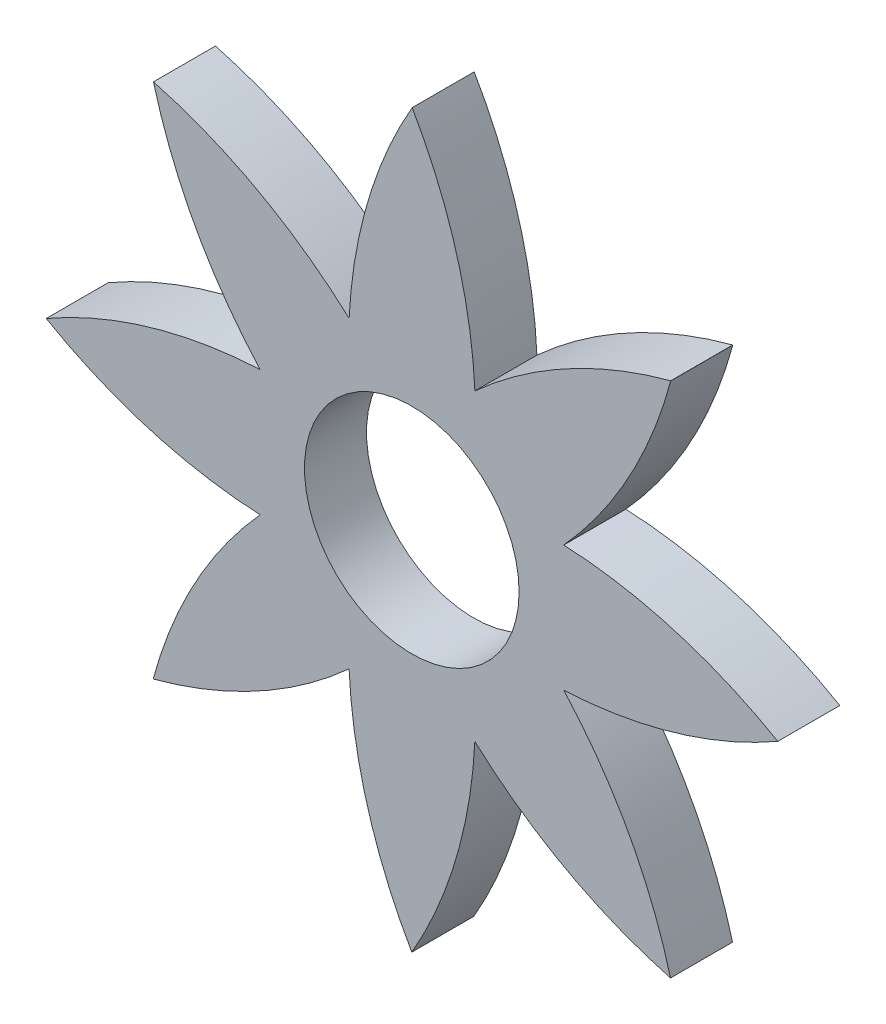
ISO-10303-21;
HEADER;
FILE_DESCRIPTION(('STEP AP214'),'2;1');
FILE_NAME('part.step','',(''),(''),'','','');
FILE_SCHEMA(('AUTOMOTIVE_DESIGN { 1 0 10303 214 1 1 1 1 }'));
ENDSEC;
DATA;
#1=APPLICATION_CONTEXT('core data for automotive mechanical design processes');
#2=APPLICATION_PROTOCOL_DEFINITION('international standard','automotive_design',2000,#1);
#3=PRODUCT_CONTEXT('',#1,'mechanical');
#4=PRODUCT('Part','Part','',(#3));
#5=PRODUCT_RELATED_PRODUCT_CATEGORY('part','',(#4));
#6=PRODUCT_DEFINITION_FORMATION('','',#4);
#7=PRODUCT_DEFINITION_CONTEXT('part definition',#1,'design');
#8=PRODUCT_DEFINITION('design','',#6,#7);
#9=PRODUCT_DEFINITION_SHAPE('','',#8);
#10=(LENGTH_UNIT() NAMED_UNIT(*) SI_UNIT(.MILLI.,.METRE.));
#11=(NAMED_UNIT(*) PLANE_ANGLE_UNIT() SI_UNIT($,.RADIAN.));
#12=(NAMED_UNIT(*) SI_UNIT($,.STERADIAN.) SOLID_ANGLE_UNIT());
#13=UNCERTAINTY_MEASURE_WITH_UNIT(LENGTH_MEASURE(1.E-05),#10,'distance_accuracy_value','');
#14=(GEOMETRIC_REPRESENTATION_CONTEXT(3) GLOBAL_UNCERTAINTY_ASSIGNED_CONTEXT((#13)) GLOBAL_UNIT_ASSIGNED_CONTEXT((#10,
#11,#12)) REPRESENTATION_CONTEXT('',''));
#15=CARTESIAN_POINT('',(0.,0.,0.));
#16=DIRECTION('',(0.,0.,1.));
#17=DIRECTION('',(1.,0.,0.));
#18=AXIS2_PLACEMENT_3D('',#15,#16,#17);
#19=CARTESIAN_POINT('',(-42.0118095691737,13.2484476399549,6.35));
#20=DIRECTION('',(0.,0.,-1.));
#21=DIRECTION('',(-1.,0.,0.));
#22=AXIS2_PLACEMENT_3D('',#19,#20,#21);
#23=CYLINDRICAL_SURFACE('',#22,48.5261851841295);
#24=CARTESIAN_POINT('',(-42.0118095691737,13.2484476399549,0.));
#25=DIRECTION('',(0.,0.,1.));
#26=DIRECTION('',(1.,0.,0.));
#27=AXIS2_PLACEMENT_3D('',#24,#25,#26);
#28=CIRCLE('',#27,48.5261851841295);
#29=CARTESIAN_POINT('',(6.45939035300629,15.5578689156175,0.));
#30=VERTEX_POINT('',#29);
#31=CARTESIAN_POINT('',(0.0399474905353088,37.4649787027565,0.));
#32=VERTEX_POINT('',#31);
#33=EDGE_CURVE('E191',#30,#32,#28,.T.);
#34=ORIENTED_EDGE('',*,*,#33,.T.);
#35=DIRECTION('',(0.,0.,-1.));
#36=VECTOR('',#35,1.);
#37=CARTESIAN_POINT('',(0.0399474905353088,37.4649787027565,6.35));
#38=LINE('',#37,#36);
#39=CARTESIAN_POINT('',(0.0399474905353088,37.4649787027565,6.35));
#40=VERTEX_POINT('',#39);
#41=EDGE_CURVE('E11',#40,#32,#38,.T.);
#42=ORIENTED_EDGE('',*,*,#41,.F.);
#43=CARTESIAN_POINT('',(-42.0118095691737,13.2484476399549,6.35));
#44=DIRECTION('',(0.,0.,1.));
#45=DIRECTION('',(1.,0.,0.));
#46=AXIS2_PLACEMENT_3D('',#43,#44,#45);
#47=CIRCLE('',#46,48.5261851841295);
#48=CARTESIAN_POINT('',(6.45939035300629,15.5578689156175,6.35));
#49=VERTEX_POINT('',#48);
#50=EDGE_CURVE('E120',#49,#40,#47,.T.);
#51=ORIENTED_EDGE('',*,*,#50,.F.);
#52=DIRECTION('',(0.,0.,-1.));
#53=VECTOR('',#52,1.);
#54=CARTESIAN_POINT('',(6.45939035300629,15.5578689156175,6.35));
#55=LINE('',#54,#53);
#56=EDGE_CURVE('E55',#49,#30,#55,.T.);
#57=ORIENTED_EDGE('',*,*,#56,.T.);
#58=EDGE_LOOP('',(#34,#42,#51,#57));
#59=FACE_BOUND('',#58,.T.);
#60=ADVANCED_FACE('F39',(#59),#23,.T.);
#61=CARTESIAN_POINT('',(42.0543252269769,13.1836543578197,6.35));
#62=DIRECTION('',(0.,0.,-1.));
#63=DIRECTION('',(-1.,0.,0.));
#64=AXIS2_PLACEMENT_3D('',#61,#62,#63);
#65=CYLINDRICAL_SURFACE('',#64,48.5261851841294);
#66=CARTESIAN_POINT('',(42.0543252269769,13.1836543578197,0.));
#67=DIRECTION('',(0.,0.,1.));
#68=DIRECTION('',(1.,0.,0.));
#69=AXIS2_PLACEMENT_3D('',#66,#67,#68);
#70=CIRCLE('',#69,48.5261851841294);
#71=CARTESIAN_POINT('',(-6.41362655563869,15.5602692871832,0.));
#72=VERTEX_POINT('',#71);
#73=EDGE_CURVE('E193',#72,#32,#70,.F.);
#74=ORIENTED_EDGE('',*,*,#73,.F.);
#75=DIRECTION('',(0.,0.,-1.));
#76=VECTOR('',#75,1.);
#77=CARTESIAN_POINT('',(-6.41362655563869,15.5602692871832,6.35));
#78=LINE('',#77,#76);
#79=CARTESIAN_POINT('',(-6.41362655563869,15.5602692871832,6.35));
#80=VERTEX_POINT('',#79);
#81=EDGE_CURVE('E47',#80,#72,#78,.T.);
#82=ORIENTED_EDGE('',*,*,#81,.F.);
#83=CARTESIAN_POINT('',(42.0543252269769,13.1836543578197,6.35));
#84=DIRECTION('',(0.,0.,1.));
#85=DIRECTION('',(1.,0.,0.));
#86=AXIS2_PLACEMENT_3D('',#83,#84,#85);
#87=CIRCLE('',#86,48.5261851841294);
#88=EDGE_CURVE('E280',#80,#40,#87,.F.);
#89=ORIENTED_EDGE('',*,*,#88,.T.);
#90=ORIENTED_EDGE('',*,*,#41,.T.);
#91=EDGE_LOOP('',(#74,#82,#89,#90));
#92=FACE_BOUND('',#91,.T.);
#93=ADVANCED_FACE('F279',(#92),#65,.T.);
#94=CARTESIAN_POINT('',(-39.0549332682235,-20.3470523146766,6.35));
#95=DIRECTION('',(0.,0.,-1.));
#96=DIRECTION('',(-1.,0.,0.));
#97=AXIS2_PLACEMENT_3D('',#94,#95,#96);
#98=CYLINDRICAL_SURFACE('',#97,48.5261851841295);
#99=CARTESIAN_POINT('',(-39.0549332682235,-20.3470523146766,0.));
#100=DIRECTION('',(0.,0.,1.));
#101=DIRECTION('',(1.,0.,0.));
#102=AXIS2_PLACEMENT_3D('',#99,#100,#101);
#103=CIRCLE('',#102,48.5261851841295);
#104=CARTESIAN_POINT('',(-26.4435240218157,26.5117035943746,0.));
#105=VERTEX_POINT('',#104);
#106=EDGE_CURVE('E196',#72,#105,#103,.T.);
#107=ORIENTED_EDGE('',*,*,#106,.T.);
#108=DIRECTION('',(0.,0.,-1.));
#109=VECTOR('',#108,1.);
#110=CARTESIAN_POINT('',(-26.4435240218157,26.5117035943746,6.35));
#111=LINE('',#110,#109);
#112=CARTESIAN_POINT('',(-26.4435240218157,26.5117035943746,6.35));
#113=VERTEX_POINT('',#112);
#114=EDGE_CURVE('E264',#113,#105,#111,.T.);
#115=ORIENTED_EDGE('',*,*,#114,.F.);
#116=CARTESIAN_POINT('',(-39.0549332682235,-20.3470523146766,6.35));
#117=DIRECTION('',(0.,0.,1.));
#118=DIRECTION('',(1.,0.,0.));
#119=AXIS2_PLACEMENT_3D('',#116,#117,#118);
#120=CIRCLE('',#119,48.5261851841295);
#121=EDGE_CURVE('E270',#80,#113,#120,.T.);
#122=ORIENTED_EDGE('',*,*,#121,.F.);
#123=ORIENTED_EDGE('',*,*,#81,.T.);
#124=EDGE_LOOP('',(#107,#115,#122,#123));
#125=FACE_BOUND('',#124,.T.);
#126=ADVANCED_FACE('F268',(#125),#98,.T.);
#127=CARTESIAN_POINT('',(20.4346164834501,39.0508658986508,6.35));
#128=DIRECTION('',(0.,0.,-1.));
#129=DIRECTION('',(-1.,0.,0.));
#130=AXIS2_PLACEMENT_3D('',#127,#128,#129);
#131=CYLINDRICAL_SURFACE('',#130,48.5261851841294);
#132=CARTESIAN_POINT('',(20.4346164834501,39.0508658986508,0.));
#133=DIRECTION('',(0.,0.,1.));
#134=DIRECTION('',(1.,0.,0.));
#135=AXIS2_PLACEMENT_3D('',#132,#133,#134);
#136=CIRCLE('',#135,48.5261851841294);
#137=CARTESIAN_POINT('',(-15.5179214250821,6.4593690557628,0.));
#138=VERTEX_POINT('',#137);
#139=EDGE_CURVE('E199',#138,#105,#136,.F.);
#140=ORIENTED_EDGE('',*,*,#139,.F.);
#141=DIRECTION('',(0.,0.,-1.));
#142=VECTOR('',#141,1.);
#143=CARTESIAN_POINT('',(-15.5179214250821,6.4593690557628,6.35));
#144=LINE('',#143,#142);
#145=CARTESIAN_POINT('',(-15.5179214250821,6.4593690557628,6.35));
#146=VERTEX_POINT('',#145);
#147=EDGE_CURVE('E262',#146,#138,#144,.T.);
#148=ORIENTED_EDGE('',*,*,#147,.F.);
#149=CARTESIAN_POINT('',(20.4346164834501,39.0508658986508,6.35));
#150=DIRECTION('',(0.,0.,1.));
#151=DIRECTION('',(1.,0.,0.));
#152=AXIS2_PLACEMENT_3D('',#149,#150,#151);
#153=CIRCLE('',#152,48.5261851841294);
#154=EDGE_CURVE('E625',#146,#113,#153,.F.);
#155=ORIENTED_EDGE('',*,*,#154,.T.);
#156=ORIENTED_EDGE('',*,*,#114,.T.);
#157=EDGE_LOOP('',(#140,#148,#155,#156));
#158=FACE_BOUND('',#157,.T.);
#159=ADVANCED_FACE('F299',(#158),#131,.T.);
#160=CARTESIAN_POINT('',(-13.2085001494195,-42.0118308664172,6.35));
#161=DIRECTION('',(0.,0.,-1.));
#162=DIRECTION('',(-1.,0.,0.));
#163=AXIS2_PLACEMENT_3D('',#160,#161,#162);
#164=CYLINDRICAL_SURFACE('',#163,48.5261851841295);
#165=CARTESIAN_POINT('',(-13.2085001494195,-42.0118308664172,0.));
#166=DIRECTION('',(0.,0.,1.));
#167=DIRECTION('',(1.,0.,0.));
#168=AXIS2_PLACEMENT_3D('',#165,#166,#167);
#169=CIRCLE('',#168,48.5261851841295);
#170=CARTESIAN_POINT('',(-37.4250312122212,0.0399261932918019,0.));
#171=VERTEX_POINT('',#170);
#172=EDGE_CURVE('E202',#138,#171,#169,.T.);
#173=ORIENTED_EDGE('',*,*,#172,.T.);
#174=DIRECTION('',(0.,0.,-1.));
#175=VECTOR('',#174,1.);
#176=CARTESIAN_POINT('',(-37.4250312122212,0.0399261932918019,6.35));
#177=LINE('',#176,#175);
#178=CARTESIAN_POINT('',(-37.4250312122212,0.0399261932918019,6.35));
#179=VERTEX_POINT('',#178);
#180=EDGE_CURVE('E260',#179,#171,#177,.T.);
#181=ORIENTED_EDGE('',*,*,#180,.F.);
#182=CARTESIAN_POINT('',(-13.2085001494195,-42.0118308664172,6.35));
#183=DIRECTION('',(0.,0.,1.));
#184=DIRECTION('',(1.,0.,0.));
#185=AXIS2_PLACEMENT_3D('',#182,#183,#184);
#186=CIRCLE('',#185,48.5261851841295);
#187=EDGE_CURVE('E626',#146,#179,#186,.T.);
#188=ORIENTED_EDGE('',*,*,#187,.F.);
#189=ORIENTED_EDGE('',*,*,#147,.T.);
#190=EDGE_LOOP('',(#173,#181,#188,#189));
#191=FACE_BOUND('',#190,.T.);
#192=ADVANCED_FACE('F304',(#191),#164,.T.);
#193=CARTESIAN_POINT('',(-13.1437068672844,42.0543039297334,6.35));
#194=DIRECTION('',(0.,0.,-1.));
#195=DIRECTION('',(-1.,0.,0.));
#196=AXIS2_PLACEMENT_3D('',#193,#194,#195);
#197=CYLINDRICAL_SURFACE('',#196,48.5261851841294);
#198=CARTESIAN_POINT('',(-13.1437068672844,42.0543039297334,0.));
#199=DIRECTION('',(0.,0.,1.));
#200=DIRECTION('',(1.,0.,0.));
#201=AXIS2_PLACEMENT_3D('',#198,#199,#200);
#202=CIRCLE('',#201,48.5261851841294);
#203=CARTESIAN_POINT('',(-15.5203217966479,-6.41364785288218,0.));
#204=VERTEX_POINT('',#203);
#205=EDGE_CURVE('E205',#204,#171,#202,.F.);
#206=ORIENTED_EDGE('',*,*,#205,.F.);
#207=DIRECTION('',(0.,0.,-1.));
#208=VECTOR('',#207,1.);
#209=CARTESIAN_POINT('',(-15.5203217966479,-6.41364785288218,6.35));
#210=LINE('',#209,#208);
#211=CARTESIAN_POINT('',(-15.5203217966479,-6.41364785288218,6.35));
#212=VERTEX_POINT('',#211);
#213=EDGE_CURVE('E258',#212,#204,#210,.T.);
#214=ORIENTED_EDGE('',*,*,#213,.F.);
#215=CARTESIAN_POINT('',(-13.1437068672844,42.0543039297334,6.35));
#216=DIRECTION('',(0.,0.,1.));
#217=DIRECTION('',(1.,0.,0.));
#218=AXIS2_PLACEMENT_3D('',#215,#216,#217);
#219=CIRCLE('',#218,48.5261851841294);
#220=EDGE_CURVE('E621',#212,#179,#219,.F.);
#221=ORIENTED_EDGE('',*,*,#220,.T.);
#222=ORIENTED_EDGE('',*,*,#180,.T.);
#223=EDGE_LOOP('',(#206,#214,#221,#222));
#224=FACE_BOUND('',#223,.T.);
#225=ADVANCED_FACE('F308',(#224),#197,.T.);
#226=CARTESIAN_POINT('',(20.386999805212,-39.054954565467,6.35));
#227=DIRECTION('',(0.,0.,-1.));
#228=DIRECTION('',(-1.,0.,0.));
#229=AXIS2_PLACEMENT_3D('',#226,#227,#228);
#230=CYLINDRICAL_SURFACE('',#229,48.5261851841295);
#231=CARTESIAN_POINT('',(20.386999805212,-39.054954565467,0.));
#232=DIRECTION('',(0.,0.,1.));
#233=DIRECTION('',(1.,0.,0.));
#234=AXIS2_PLACEMENT_3D('',#231,#232,#233);
#235=CIRCLE('',#234,48.5261851841295);
#236=CARTESIAN_POINT('',(-26.4717561038393,-26.4435453190592,0.));
#237=VERTEX_POINT('',#236);
#238=EDGE_CURVE('E208',#204,#237,#235,.T.);
#239=ORIENTED_EDGE('',*,*,#238,.T.);
#240=DIRECTION('',(0.,0.,-1.));
#241=VECTOR('',#240,1.);
#242=CARTESIAN_POINT('',(-26.4717561038393,-26.4435453190592,6.35));
#243=LINE('',#242,#241);
#244=CARTESIAN_POINT('',(-26.4717561038393,-26.4435453190592,6.35));
#245=VERTEX_POINT('',#244);
#246=EDGE_CURVE('E256',#245,#237,#243,.T.);
#247=ORIENTED_EDGE('',*,*,#246,.F.);
#248=CARTESIAN_POINT('',(20.386999805212,-39.054954565467,6.35));
#249=DIRECTION('',(0.,0.,1.));
#250=DIRECTION('',(1.,0.,0.));
#251=AXIS2_PLACEMENT_3D('',#248,#249,#250);
#252=CIRCLE('',#251,48.5261851841295);
#253=EDGE_CURVE('E633',#212,#245,#252,.T.);
#254=ORIENTED_EDGE('',*,*,#253,.F.);
#255=ORIENTED_EDGE('',*,*,#213,.T.);
#256=EDGE_LOOP('',(#239,#247,#254,#255));
#257=FACE_BOUND('',#256,.T.);
#258=ADVANCED_FACE('F312',(#257),#230,.T.);
#259=CARTESIAN_POINT('',(-39.0109184081154,20.4345951862066,6.35));
#260=DIRECTION('',(0.,0.,-1.));
#261=DIRECTION('',(-1.,0.,0.));
#262=AXIS2_PLACEMENT_3D('',#259,#260,#261);
#263=CYLINDRICAL_SURFACE('',#262,48.5261851841294);
#264=CARTESIAN_POINT('',(-39.0109184081154,20.4345951862066,0.));
#265=DIRECTION('',(0.,0.,1.));
#266=DIRECTION('',(1.,0.,0.));
#267=AXIS2_PLACEMENT_3D('',#264,#265,#266);
#268=CIRCLE('',#267,48.5261851841294);
#269=CARTESIAN_POINT('',(-6.41942156522748,-15.5179427223256,0.));
#270=VERTEX_POINT('',#269);
#271=EDGE_CURVE('E211',#270,#237,#268,.F.);
#272=ORIENTED_EDGE('',*,*,#271,.F.);
#273=DIRECTION('',(0.,0.,-1.));
#274=VECTOR('',#273,1.);
#275=CARTESIAN_POINT('',(-6.41942156522748,-15.5179427223256,6.35));
#276=LINE('',#275,#274);
#277=CARTESIAN_POINT('',(-6.41942156522748,-15.5179427223256,6.35));
#278=VERTEX_POINT('',#277);
#279=EDGE_CURVE('E254',#278,#270,#276,.T.);
#280=ORIENTED_EDGE('',*,*,#279,.F.);
#281=CARTESIAN_POINT('',(-39.0109184081154,20.4345951862066,6.35));
#282=DIRECTION('',(0.,0.,1.));
#283=DIRECTION('',(1.,0.,0.));
#284=AXIS2_PLACEMENT_3D('',#281,#282,#283);
#285=CIRCLE('',#284,48.5261851841294);
#286=EDGE_CURVE('E615',#278,#245,#285,.F.);
#287=ORIENTED_EDGE('',*,*,#286,.T.);
#288=ORIENTED_EDGE('',*,*,#246,.T.);
#289=EDGE_LOOP('',(#272,#280,#287,#288));
#290=FACE_BOUND('',#289,.T.);
#291=ADVANCED_FACE('F316',(#290),#263,.T.);
#292=CARTESIAN_POINT('',(42.0517783569525,-13.208521446663,6.35));
#293=DIRECTION('',(0.,0.,-1.));
#294=DIRECTION('',(-1.,0.,0.));
#295=AXIS2_PLACEMENT_3D('',#292,#293,#294);
#296=CYLINDRICAL_SURFACE('',#295,48.5261851841295);
#297=CARTESIAN_POINT('',(42.0517783569525,-13.208521446663,0.));
#298=DIRECTION('',(0.,0.,1.));
#299=DIRECTION('',(1.,0.,0.));
#300=AXIS2_PLACEMENT_3D('',#297,#298,#299);
#301=CIRCLE('',#300,48.5261851841295);
#302=CARTESIAN_POINT('',(2.12972435104097E-05,-37.4250525094646,0.));
#303=VERTEX_POINT('',#302);
#304=EDGE_CURVE('E214',#270,#303,#301,.T.);
#305=ORIENTED_EDGE('',*,*,#304,.T.);
#306=DIRECTION('',(0.,0.,-1.));
#307=VECTOR('',#306,1.);
#308=CARTESIAN_POINT('',(2.12972435104097E-05,-37.4250525094646,6.35));
#309=LINE('',#308,#307);
#310=CARTESIAN_POINT('',(2.12972435104097E-05,-37.4250525094646,6.35));
#311=VERTEX_POINT('',#310);
#312=EDGE_CURVE('E252',#311,#303,#309,.T.);
#313=ORIENTED_EDGE('',*,*,#312,.F.);
#314=CARTESIAN_POINT('',(42.0517783569525,-13.208521446663,6.35));
#315=DIRECTION('',(0.,0.,1.));
#316=DIRECTION('',(1.,0.,0.));
#317=AXIS2_PLACEMENT_3D('',#314,#315,#316);
#318=CIRCLE('',#317,48.5261851841295);
#319=EDGE_CURVE('E636',#278,#311,#318,.T.);
#320=ORIENTED_EDGE('',*,*,#319,.F.);
#321=ORIENTED_EDGE('',*,*,#279,.T.);
#322=EDGE_LOOP('',(#305,#313,#320,#321));
#323=FACE_BOUND('',#322,.T.);
#324=ADVANCED_FACE('F320',(#323),#296,.T.);
#325=CARTESIAN_POINT('',(-42.0143564391981,-13.1437281645278,6.35));
#326=DIRECTION('',(0.,0.,-1.));
#327=DIRECTION('',(-1.,0.,0.));
#328=AXIS2_PLACEMENT_3D('',#325,#326,#327);
#329=CYLINDRICAL_SURFACE('',#328,48.5261851841294);
#330=CARTESIAN_POINT('',(-42.0143564391981,-13.1437281645278,0.));
#331=DIRECTION('',(0.,0.,1.));
#332=DIRECTION('',(1.,0.,0.));
#333=AXIS2_PLACEMENT_3D('',#330,#331,#332);
#334=CIRCLE('',#333,48.5261851841294);
#335=CARTESIAN_POINT('',(6.45359534341747,-15.5203430938914,0.));
#336=VERTEX_POINT('',#335);
#337=EDGE_CURVE('E217',#336,#303,#334,.F.);
#338=ORIENTED_EDGE('',*,*,#337,.F.);
#339=DIRECTION('',(0.,0.,-1.));
#340=VECTOR('',#339,1.);
#341=CARTESIAN_POINT('',(6.45359534341747,-15.5203430938914,6.35));
#342=LINE('',#341,#340);
#343=CARTESIAN_POINT('',(6.45359534341747,-15.5203430938914,6.35));
#344=VERTEX_POINT('',#343);
#345=EDGE_CURVE('E250',#344,#336,#342,.T.);
#346=ORIENTED_EDGE('',*,*,#345,.F.);
#347=CARTESIAN_POINT('',(-42.0143564391981,-13.1437281645278,6.35));
#348=DIRECTION('',(0.,0.,1.));
#349=DIRECTION('',(1.,0.,0.));
#350=AXIS2_PLACEMENT_3D('',#347,#348,#349);
#351=CIRCLE('',#350,48.5261851841294);
#352=EDGE_CURVE('E608',#344,#311,#351,.F.);
#353=ORIENTED_EDGE('',*,*,#352,.T.);
#354=ORIENTED_EDGE('',*,*,#312,.T.);
#355=EDGE_LOOP('',(#338,#346,#353,#354));
#356=FACE_BOUND('',#355,.T.);
#357=ADVANCED_FACE('F324',(#356),#329,.T.);
#358=CARTESIAN_POINT('',(39.0949020560023,20.3869785079685,6.35));
#359=DIRECTION('',(0.,0.,-1.));
#360=DIRECTION('',(-1.,0.,0.));
#361=AXIS2_PLACEMENT_3D('',#358,#359,#360);
#362=CYLINDRICAL_SURFACE('',#361,48.5261851841295);
#363=CARTESIAN_POINT('',(39.0949020560023,20.3869785079685,0.));
#364=DIRECTION('',(0.,0.,1.));
#365=DIRECTION('',(1.,0.,0.));
#366=AXIS2_PLACEMENT_3D('',#363,#364,#365);
#367=CIRCLE('',#366,48.5261851841295);
#368=CARTESIAN_POINT('',(26.4834928095945,-26.4717774010828,0.));
#369=VERTEX_POINT('',#368);
#370=EDGE_CURVE('E220',#336,#369,#367,.T.);
#371=ORIENTED_EDGE('',*,*,#370,.T.);
#372=DIRECTION('',(0.,0.,-1.));
#373=VECTOR('',#372,1.);
#374=CARTESIAN_POINT('',(26.4834928095945,-26.4717774010828,6.35));
#375=LINE('',#374,#373);
#376=CARTESIAN_POINT('',(26.4834928095945,-26.4717774010828,6.35));
#377=VERTEX_POINT('',#376);
#378=EDGE_CURVE('E248',#377,#369,#375,.T.);
#379=ORIENTED_EDGE('',*,*,#378,.F.);
#380=CARTESIAN_POINT('',(39.0949020560023,20.3869785079685,6.35));
#381=DIRECTION('',(0.,0.,1.));
#382=DIRECTION('',(1.,0.,0.));
#383=AXIS2_PLACEMENT_3D('',#380,#381,#382);
#384=CIRCLE('',#383,48.5261851841295);
#385=EDGE_CURVE('E639',#344,#377,#384,.T.);
#386=ORIENTED_EDGE('',*,*,#385,.F.);
#387=ORIENTED_EDGE('',*,*,#345,.T.);
#388=EDGE_LOOP('',(#371,#379,#386,#387));
#389=FACE_BOUND('',#388,.T.);
#390=ADVANCED_FACE('F328',(#389),#362,.T.);
#391=CARTESIAN_POINT('',(-20.3946476956713,-39.0109397053589,6.35));
#392=DIRECTION('',(0.,0.,-1.));
#393=DIRECTION('',(-1.,0.,0.));
#394=AXIS2_PLACEMENT_3D('',#391,#392,#393);
#395=CYLINDRICAL_SURFACE('',#394,48.5261851841294);
#396=CARTESIAN_POINT('',(-20.3946476956713,-39.0109397053589,0.));
#397=DIRECTION('',(0.,0.,1.));
#398=DIRECTION('',(1.,0.,0.));
#399=AXIS2_PLACEMENT_3D('',#396,#397,#398);
#400=CIRCLE('',#399,48.5261851841294);
#401=CARTESIAN_POINT('',(15.557890212861,-6.41944286247095,0.));
#402=VERTEX_POINT('',#401);
#403=EDGE_CURVE('E223',#402,#369,#400,.F.);
#404=ORIENTED_EDGE('',*,*,#403,.F.);
#405=DIRECTION('',(0.,0.,-1.));
#406=VECTOR('',#405,1.);
#407=CARTESIAN_POINT('',(15.557890212861,-6.41944286247095,6.35));
#408=LINE('',#407,#406);
#409=CARTESIAN_POINT('',(15.557890212861,-6.41944286247095,6.35));
#410=VERTEX_POINT('',#409);
#411=EDGE_CURVE('E246',#410,#402,#408,.T.);
#412=ORIENTED_EDGE('',*,*,#411,.F.);
#413=CARTESIAN_POINT('',(-20.3946476956713,-39.0109397053589,6.35));
#414=DIRECTION('',(0.,0.,1.));
#415=DIRECTION('',(1.,0.,0.));
#416=AXIS2_PLACEMENT_3D('',#413,#414,#415);
#417=CIRCLE('',#416,48.5261851841294);
#418=EDGE_CURVE('E601',#410,#377,#417,.F.);
#419=ORIENTED_EDGE('',*,*,#418,.T.);
#420=ORIENTED_EDGE('',*,*,#378,.T.);
#421=EDGE_LOOP('',(#404,#412,#419,#420));
#422=FACE_BOUND('',#421,.T.);
#423=ADVANCED_FACE('F332',(#422),#395,.T.);
#424=CARTESIAN_POINT('',(13.2484689371984,42.0517570597091,6.35));
#425=DIRECTION('',(0.,0.,-1.));
#426=DIRECTION('',(-1.,0.,0.));
#427=AXIS2_PLACEMENT_3D('',#424,#425,#426);
#428=CYLINDRICAL_SURFACE('',#427,48.5261851841295);
#429=CARTESIAN_POINT('',(13.2484689371984,42.0517570597091,0.));
#430=DIRECTION('',(0.,0.,1.));
#431=DIRECTION('',(1.,0.,0.));
#432=AXIS2_PLACEMENT_3D('',#429,#430,#431);
#433=CIRCLE('',#432,48.5261851841295);
#434=CARTESIAN_POINT('',(37.465,0.,0.));
#435=VERTEX_POINT('',#434);
#436=EDGE_CURVE('E226',#402,#435,#433,.T.);
#437=ORIENTED_EDGE('',*,*,#436,.T.);
#438=DIRECTION('',(0.,0.,-1.));
#439=VECTOR('',#438,1.);
#440=CARTESIAN_POINT('',(37.465,0.,6.35));
#441=LINE('',#440,#439);
#442=CARTESIAN_POINT('',(37.465,0.,6.35));
#443=VERTEX_POINT('',#442);
#444=EDGE_CURVE('E244',#443,#435,#441,.T.);
#445=ORIENTED_EDGE('',*,*,#444,.F.);
#446=CARTESIAN_POINT('',(13.2484689371984,42.0517570597091,6.35));
#447=DIRECTION('',(0.,0.,1.));
#448=DIRECTION('',(1.,0.,0.));
#449=AXIS2_PLACEMENT_3D('',#446,#447,#448);
#450=CIRCLE('',#449,48.5261851841295);
#451=EDGE_CURVE('E642',#410,#443,#450,.T.);
#452=ORIENTED_EDGE('',*,*,#451,.F.);
#453=ORIENTED_EDGE('',*,*,#411,.T.);
#454=EDGE_LOOP('',(#437,#445,#452,#453));
#455=FACE_BOUND('',#454,.T.);
#456=ADVANCED_FACE('F336',(#455),#428,.T.);
#457=CARTESIAN_POINT('',(13.1836756550632,-42.0143777364416,6.35));
#458=DIRECTION('',(0.,0.,-1.));
#459=DIRECTION('',(-1.,0.,0.));
#460=AXIS2_PLACEMENT_3D('',#457,#458,#459);
#461=CYLINDRICAL_SURFACE('',#460,48.5261851841294);
#462=CARTESIAN_POINT('',(13.1836756550632,-42.0143777364416,0.));
#463=DIRECTION('',(0.,0.,1.));
#464=DIRECTION('',(1.,0.,0.));
#465=AXIS2_PLACEMENT_3D('',#462,#463,#464);
#466=CIRCLE('',#465,48.5261851841294);
#467=CARTESIAN_POINT('',(15.5602905844267,6.45357404617399,0.));
#468=VERTEX_POINT('',#467);
#469=EDGE_CURVE('E229',#468,#435,#466,.F.);
#470=ORIENTED_EDGE('',*,*,#469,.F.);
#471=DIRECTION('',(0.,0.,-1.));
#472=VECTOR('',#471,1.);
#473=CARTESIAN_POINT('',(15.5602905844267,6.45357404617399,6.35));
#474=LINE('',#473,#472);
#475=CARTESIAN_POINT('',(15.5602905844267,6.45357404617399,6.35));
#476=VERTEX_POINT('',#475);
#477=EDGE_CURVE('E180',#476,#468,#474,.T.);
#478=ORIENTED_EDGE('',*,*,#477,.F.);
#479=CARTESIAN_POINT('',(13.1836756550632,-42.0143777364416,6.35));
#480=DIRECTION('',(0.,0.,1.));
#481=DIRECTION('',(1.,0.,0.));
#482=AXIS2_PLACEMENT_3D('',#479,#480,#481);
#483=CIRCLE('',#482,48.5261851841294);
#484=EDGE_CURVE('E170',#476,#443,#483,.F.);
#485=ORIENTED_EDGE('',*,*,#484,.T.);
#486=ORIENTED_EDGE('',*,*,#444,.T.);
#487=EDGE_LOOP('',(#470,#478,#485,#486));
#488=FACE_BOUND('',#487,.T.);
#489=ADVANCED_FACE('F340',(#488),#461,.T.);
#490=CARTESIAN_POINT('',(-20.3470310174331,39.0948807587588,6.35));
#491=DIRECTION('',(0.,0.,-1.));
#492=DIRECTION('',(-1.,0.,0.));
#493=AXIS2_PLACEMENT_3D('',#490,#491,#492);
#494=CYLINDRICAL_SURFACE('',#493,48.5261851841295);
#495=CARTESIAN_POINT('',(-20.3470310174331,39.0948807587588,0.));
#496=DIRECTION('',(0.,0.,1.));
#497=DIRECTION('',(1.,0.,0.));
#498=AXIS2_PLACEMENT_3D('',#495,#496,#497);
#499=CIRCLE('',#498,48.5261851841295);
#500=CARTESIAN_POINT('',(26.5092436609007,26.4742559012901,0.));
#501=VERTEX_POINT('',#500);
#502=EDGE_CURVE('E177',#468,#501,#499,.T.);
#503=ORIENTED_EDGE('',*,*,#502,.T.);
#504=DIRECTION('',(0.,0.,-1.));
#505=VECTOR('',#504,1.);
#506=CARTESIAN_POINT('',(26.5092436609007,26.4742559012901,6.35));
#507=LINE('',#506,#505);
#508=CARTESIAN_POINT('',(26.5092436609007,26.4742559012901,6.35));
#509=VERTEX_POINT('',#508);
#510=EDGE_CURVE('E174',#509,#501,#507,.T.);
#511=ORIENTED_EDGE('',*,*,#510,.F.);
#512=CARTESIAN_POINT('',(-20.3470310174331,39.0948807587588,6.35));
#513=DIRECTION('',(0.,0.,1.));
#514=DIRECTION('',(1.,0.,0.));
#515=AXIS2_PLACEMENT_3D('',#512,#513,#514);
#516=CIRCLE('',#515,48.5261851841295);
#517=EDGE_CURVE('E163',#476,#509,#516,.T.);
#518=ORIENTED_EDGE('',*,*,#517,.F.);
#519=ORIENTED_EDGE('',*,*,#477,.T.);
#520=EDGE_LOOP('',(#503,#511,#518,#519));
#521=FACE_BOUND('',#520,.T.);
#522=ADVANCED_FACE('F175',(#521),#494,.T.);
#523=CARTESIAN_POINT('',(0.,0.,6.35));
#524=DIRECTION('',(0.,0.,-1.));
#525=DIRECTION('',(-1.,0.,0.));
#526=AXIS2_PLACEMENT_3D('',#523,#524,#525);
#527=CYLINDRICAL_SURFACE('',#526,37.465);
#528=CARTESIAN_POINT('',(0.,0.,0.));
#529=DIRECTION('',(0.,0.,1.));
#530=DIRECTION('',(1.,0.,0.));
#531=AXIS2_PLACEMENT_3D('',#528,#529,#530);
#532=CIRCLE('',#531,37.465);
#533=CARTESIAN_POINT('',(26.5025029388673,26.4810038135892,0.));
#534=VERTEX_POINT('',#533);
#535=EDGE_CURVE('E233',#501,#534,#532,.T.);
#536=ORIENTED_EDGE('',*,*,#535,.T.);
#537=DIRECTION('',(0.,0.,-1.));
#538=VECTOR('',#537,1.);
#539=CARTESIAN_POINT('',(26.5025029388673,26.4810038135892,6.35));
#540=LINE('',#539,#538);
#541=CARTESIAN_POINT('',(26.5025029388673,26.4810038135892,6.35));
#542=VERTEX_POINT('',#541);
#543=EDGE_CURVE('E108',#542,#534,#540,.T.);
#544=ORIENTED_EDGE('',*,*,#543,.F.);
#545=CARTESIAN_POINT('',(0.,0.,6.35));
#546=DIRECTION('',(0.,0.,1.));
#547=DIRECTION('',(1.,0.,0.));
#548=AXIS2_PLACEMENT_3D('',#545,#546,#547);
#549=CIRCLE('',#548,37.465);
#550=EDGE_CURVE('E168',#509,#542,#549,.T.);
#551=ORIENTED_EDGE('',*,*,#550,.F.);
#552=ORIENTED_EDGE('',*,*,#510,.T.);
#553=EDGE_LOOP('',(#536,#544,#551,#552));
#554=FACE_BOUND('',#553,.T.);
#555=ADVANCED_FACE('F182',(#554),#527,.T.);
#556=CARTESIAN_POINT('',(39.0508871958942,-20.3946689929148,6.35));
#557=DIRECTION('',(0.,0.,-1.));
#558=DIRECTION('',(-1.,0.,0.));
#559=AXIS2_PLACEMENT_3D('',#556,#557,#558);
#560=CYLINDRICAL_SURFACE('',#559,48.5261851841294);
#561=CARTESIAN_POINT('',(39.0508871958942,-20.3946689929148,0.));
#562=DIRECTION('',(0.,0.,1.));
#563=DIRECTION('',(1.,0.,0.));
#564=AXIS2_PLACEMENT_3D('',#561,#562,#563);
#565=CIRCLE('',#564,48.5261851841294);
#566=EDGE_CURVE('E235',#30,#534,#565,.F.);
#567=ORIENTED_EDGE('',*,*,#566,.F.);
#568=ORIENTED_EDGE('',*,*,#56,.F.);
#569=CARTESIAN_POINT('',(39.0508871958942,-20.3946689929148,6.35));
#570=DIRECTION('',(0.,0.,1.));
#571=DIRECTION('',(1.,0.,0.));
#572=AXIS2_PLACEMENT_3D('',#569,#570,#571);
#573=CIRCLE('',#572,48.5261851841294);
#574=EDGE_CURVE('E183',#49,#542,#573,.F.);
#575=ORIENTED_EDGE('',*,*,#574,.T.);
#576=ORIENTED_EDGE('',*,*,#543,.T.);
#577=EDGE_LOOP('',(#567,#568,#575,#576));
#578=FACE_BOUND('',#577,.T.);
#579=ADVANCED_FACE('F281',(#578),#560,.T.);
#580=CARTESIAN_POINT('',(0.,0.,6.35));
#581=DIRECTION('',(0.,0.,-1.));
#582=DIRECTION('',(-1.,0.,0.));
#583=AXIS2_PLACEMENT_3D('',#580,#581,#582);
#584=CYLINDRICAL_SURFACE('',#583,10.9855);
#585=CARTESIAN_POINT('',(0.,0.,6.35));
#586=DIRECTION('',(0.,0.,1.));
#587=DIRECTION('',(1.,0.,0.));
#588=AXIS2_PLACEMENT_3D('',#585,#586,#587);
#589=CIRCLE('',#588,10.9855);
#590=CARTESIAN_POINT('',(10.9855,0.,6.35));
#591=VERTEX_POINT('',#590);
#592=EDGE_CURVE('E185',#591,#591,#589,.T.);
#593=ORIENTED_EDGE('',*,*,#592,.T.);
#594=EDGE_LOOP('',(#593));
#595=FACE_BOUND('',#594,.T.);
#596=CARTESIAN_POINT('',(0.,0.,0.));
#597=DIRECTION('',(0.,0.,1.));
#598=DIRECTION('',(1.,0.,0.));
#599=AXIS2_PLACEMENT_3D('',#596,#597,#598);
#600=CIRCLE('',#599,10.9855);
#601=CARTESIAN_POINT('',(10.9855,0.,0.));
#602=VERTEX_POINT('',#601);
#603=EDGE_CURVE('E238',#602,#602,#600,.T.);
#604=ORIENTED_EDGE('',*,*,#603,.F.);
#605=EDGE_LOOP('',(#604));
#606=FACE_BOUND('',#605,.T.);
#607=ADVANCED_FACE('F283',(#595,#606),#584,.F.);
#608=CARTESIAN_POINT('',(0.,0.,6.35));
#609=DIRECTION('',(0.,0.,1.));
#610=DIRECTION('',(1.,0.,0.));
#611=AXIS2_PLACEMENT_3D('',#608,#609,#610);
#612=PLANE('',#611);
#613=ORIENTED_EDGE('',*,*,#50,.T.);
#614=ORIENTED_EDGE('',*,*,#88,.F.);
#615=ORIENTED_EDGE('',*,*,#121,.T.);
#616=ORIENTED_EDGE('',*,*,#154,.F.);
#617=ORIENTED_EDGE('',*,*,#187,.T.);
#618=ORIENTED_EDGE('',*,*,#220,.F.);
#619=ORIENTED_EDGE('',*,*,#253,.T.);
#620=ORIENTED_EDGE('',*,*,#286,.F.);
#621=ORIENTED_EDGE('',*,*,#319,.T.);
#622=ORIENTED_EDGE('',*,*,#352,.F.);
#623=ORIENTED_EDGE('',*,*,#385,.T.);
#624=ORIENTED_EDGE('',*,*,#418,.F.);
#625=ORIENTED_EDGE('',*,*,#451,.T.);
#626=ORIENTED_EDGE('',*,*,#484,.F.);
#627=ORIENTED_EDGE('',*,*,#517,.T.);
#628=ORIENTED_EDGE('',*,*,#550,.T.);
#629=ORIENTED_EDGE('',*,*,#574,.F.);
#630=EDGE_LOOP('',(#613,#614,#615,#616,#617,#618,#619,#620,#621,#622,#623,#624,#625,#626,#627,
#628,#629));
#631=FACE_BOUND('',#630,.T.);
#632=ORIENTED_EDGE('',*,*,#592,.F.);
#633=EDGE_LOOP('',(#632));
#634=FACE_BOUND('',#633,.T.);
#635=ADVANCED_FACE('F165',(#631,#634),#612,.T.);
#636=CARTESIAN_POINT('',(0.,0.,0.));
#637=DIRECTION('',(0.,0.,1.));
#638=DIRECTION('',(1.,0.,0.));
#639=AXIS2_PLACEMENT_3D('',#636,#637,#638);
#640=PLANE('',#639);
#641=ORIENTED_EDGE('',*,*,#33,.F.);
#642=ORIENTED_EDGE('',*,*,#566,.T.);
#643=ORIENTED_EDGE('',*,*,#535,.F.);
#644=ORIENTED_EDGE('',*,*,#502,.F.);
#645=ORIENTED_EDGE('',*,*,#469,.T.);
#646=ORIENTED_EDGE('',*,*,#436,.F.);
#647=ORIENTED_EDGE('',*,*,#403,.T.);
#648=ORIENTED_EDGE('',*,*,#370,.F.);
#649=ORIENTED_EDGE('',*,*,#337,.T.);
#650=ORIENTED_EDGE('',*,*,#304,.F.);
#651=ORIENTED_EDGE('',*,*,#271,.T.);
#652=ORIENTED_EDGE('',*,*,#238,.F.);
#653=ORIENTED_EDGE('',*,*,#205,.T.);
#654=ORIENTED_EDGE('',*,*,#172,.F.);
#655=ORIENTED_EDGE('',*,*,#139,.T.);
#656=ORIENTED_EDGE('',*,*,#106,.F.);
#657=ORIENTED_EDGE('',*,*,#73,.T.);
#658=EDGE_LOOP('',(#641,#642,#643,#644,#645,#646,#647,#648,#649,#650,#651,#652,#653,#654,#655,
#656,#657));
#659=FACE_BOUND('',#658,.T.);
#660=ORIENTED_EDGE('',*,*,#603,.T.);
#661=EDGE_LOOP('',(#660));
#662=FACE_BOUND('',#661,.T.);
#663=ADVANCED_FACE('F275',(#659,#662),#640,.F.);
#664=CLOSED_SHELL('',(#60,#93,#126,#159,#192,#225,#258,#291,#324,#357,#390,#423,#456,#489,#522,
#555,#579,#607,#635,#663));
#665=MANIFOLD_SOLID_BREP('B2',#664);
#666=ADVANCED_BREP_SHAPE_REPRESENTATION('',(#18,#665),#14);
#667=SHAPE_DEFINITION_REPRESENTATION(#9,#666);
ENDSEC;
END-ISO-10303-21;
